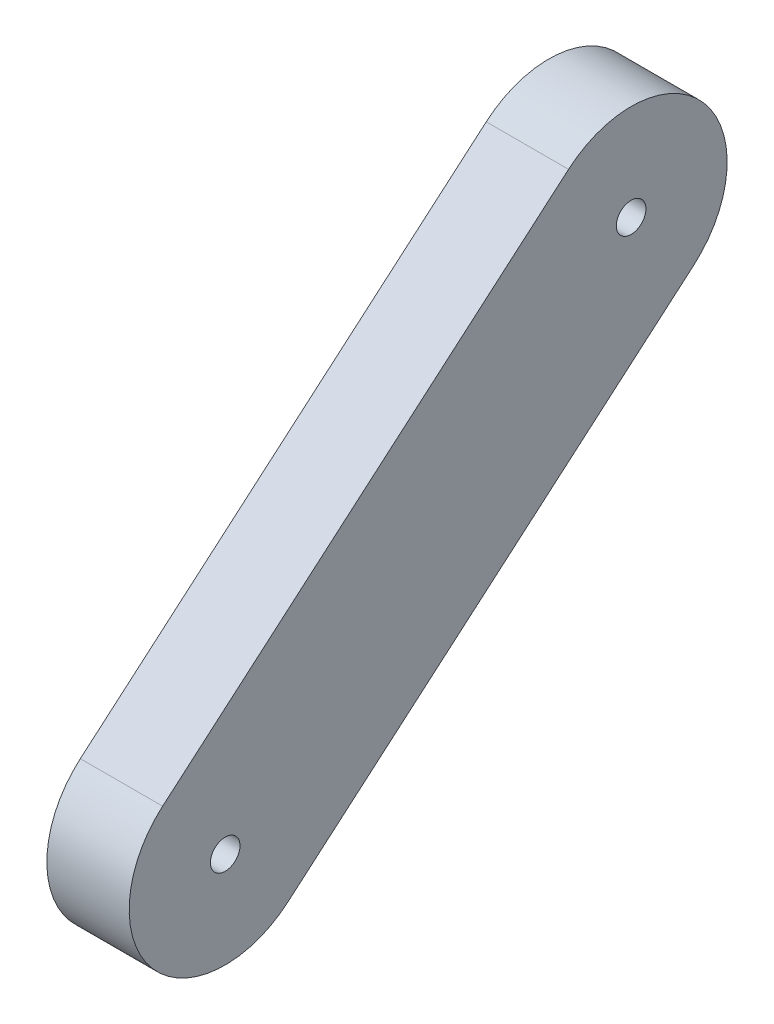
ISO-10303-21;
HEADER;
FILE_DESCRIPTION(('STEP AP214'),'2;1');
FILE_NAME('part.step','',(''),(''),'','','');
FILE_SCHEMA(('AUTOMOTIVE_DESIGN { 1 0 10303 214 1 1 1 1 }'));
ENDSEC;
DATA;
#1=APPLICATION_CONTEXT('core data for automotive mechanical design processes');
#2=APPLICATION_PROTOCOL_DEFINITION('international standard','automotive_design',2000,#1);
#3=PRODUCT_CONTEXT('',#1,'mechanical');
#4=PRODUCT('Part','Part','',(#3));
#5=PRODUCT_RELATED_PRODUCT_CATEGORY('part','',(#4));
#6=PRODUCT_DEFINITION_FORMATION('','',#4);
#7=PRODUCT_DEFINITION_CONTEXT('part definition',#1,'design');
#8=PRODUCT_DEFINITION('design','',#6,#7);
#9=PRODUCT_DEFINITION_SHAPE('','',#8);
#10=(LENGTH_UNIT() NAMED_UNIT(*) SI_UNIT(.MILLI.,.METRE.));
#11=(NAMED_UNIT(*) PLANE_ANGLE_UNIT() SI_UNIT($,.RADIAN.));
#12=(NAMED_UNIT(*) SI_UNIT($,.STERADIAN.) SOLID_ANGLE_UNIT());
#13=UNCERTAINTY_MEASURE_WITH_UNIT(LENGTH_MEASURE(1.E-05),#10,'distance_accuracy_value','');
#14=(GEOMETRIC_REPRESENTATION_CONTEXT(3) GLOBAL_UNCERTAINTY_ASSIGNED_CONTEXT((#13)) GLOBAL_UNIT_ASSIGNED_CONTEXT((#10,
#11,#12)) REPRESENTATION_CONTEXT('',''));
#15=CARTESIAN_POINT('',(0.,0.,0.));
#16=DIRECTION('',(0.,0.,1.));
#17=DIRECTION('',(1.,0.,0.));
#18=AXIS2_PLACEMENT_3D('',#15,#16,#17);
#19=CARTESIAN_POINT('',(12.827,-82.55,508.));
#20=DIRECTION('',(-1.,0.,0.));
#21=DIRECTION('',(0.,-1.,0.));
#22=AXIS2_PLACEMENT_3D('',#19,#20,#21);
#23=PLANE('',#22);
#24=CARTESIAN_POINT('',(12.827,-82.55,508.));
#25=DIRECTION('',(-1.,0.,0.));
#26=DIRECTION('',(0.,-1.,0.));
#27=AXIS2_PLACEMENT_3D('',#24,#25,#26);
#28=CIRCLE('',#27,6.84999999999996);
#29=CARTESIAN_POINT('',(12.827,-75.7,508.));
#30=VERTEX_POINT('',#29);
#31=EDGE_CURVE('E106',#30,#30,#28,.T.);
#32=ORIENTED_EDGE('',*,*,#31,.F.);
#33=EDGE_LOOP('',(#32));
#34=FACE_BOUND('',#33,.T.);
#35=CARTESIAN_POINT('',(12.827,-82.55,508.));
#36=DIRECTION('',(-1.,0.,0.));
#37=DIRECTION('',(0.,-1.,0.));
#38=AXIS2_PLACEMENT_3D('',#35,#36,#37);
#39=CIRCLE('',#38,44.45);
#40=CARTESIAN_POINT('',(12.827,-48.8282557456023,536.959393371426));
#41=VERTEX_POINT('',#40);
#42=CARTESIAN_POINT('',(12.827,-116.271744254398,479.040606628574));
#43=VERTEX_POINT('',#42);
#44=EDGE_CURVE('E91',#41,#43,#39,.T.);
#45=ORIENTED_EDGE('',*,*,#44,.T.);
#46=DIRECTION('',(0.,-0.651504912742992,0.758644415172053));
#47=VECTOR('',#46,1.);
#48=CARTESIAN_POINT('',(12.827,-116.271744254398,479.040606628574));
#49=LINE('',#48,#47);
#50=CARTESIAN_POINT('',(12.8270000000001,-277.6169358952,666.918896045933));
#51=VERTEX_POINT('',#50);
#52=EDGE_CURVE('E86',#43,#51,#49,.T.);
#53=ORIENTED_EDGE('',*,*,#52,.T.);
#54=CARTESIAN_POINT('',(12.8270000000001,-243.895191640802,695.878289417359));
#55=DIRECTION('',(-1.,0.,0.));
#56=DIRECTION('',(0.,-1.,0.));
#57=AXIS2_PLACEMENT_3D('',#54,#55,#56);
#58=CIRCLE('',#57,44.45);
#59=CARTESIAN_POINT('',(12.827,-210.173447386404,724.837682788785));
#60=VERTEX_POINT('',#59);
#61=EDGE_CURVE('E89',#51,#60,#58,.T.);
#62=ORIENTED_EDGE('',*,*,#61,.T.);
#63=DIRECTION('',(0.,0.651504912742992,-0.758644415172053));
#64=VECTOR('',#63,1.);
#65=CARTESIAN_POINT('',(12.827,-48.8282557456023,536.959393371426));
#66=LINE('',#65,#64);
#67=EDGE_CURVE('E56',#60,#41,#66,.T.);
#68=ORIENTED_EDGE('',*,*,#67,.T.);
#69=EDGE_LOOP('',(#45,#53,#62,#68));
#70=FACE_BOUND('',#69,.T.);
#71=CARTESIAN_POINT('',(12.8270000000001,-243.895191640802,695.878289417359));
#72=DIRECTION('',(-1.,0.,0.));
#73=DIRECTION('',(0.,-1.,0.));
#74=AXIS2_PLACEMENT_3D('',#71,#72,#73);
#75=CIRCLE('',#74,6.84999999999996);
#76=CARTESIAN_POINT('',(12.8270000000001,-237.045191640802,695.878289417359));
#77=VERTEX_POINT('',#76);
#78=EDGE_CURVE('E121',#77,#77,#75,.T.);
#79=ORIENTED_EDGE('',*,*,#78,.F.);
#80=EDGE_LOOP('',(#79));
#81=FACE_BOUND('',#80,.T.);
#82=ADVANCED_FACE('F39',(#34,#70,#81),#23,.T.);
#83=CARTESIAN_POINT('',(50.927,-82.55,508.));
#84=DIRECTION('',(-1.,0.,0.));
#85=DIRECTION('',(0.,-1.,0.));
#86=AXIS2_PLACEMENT_3D('',#83,#84,#85);
#87=PLANE('',#86);
#88=CARTESIAN_POINT('',(50.927,-82.55,508.));
#89=DIRECTION('',(-1.,0.,0.));
#90=DIRECTION('',(0.,-1.,0.));
#91=AXIS2_PLACEMENT_3D('',#88,#89,#90);
#92=CIRCLE('',#91,44.45);
#93=CARTESIAN_POINT('',(50.927,-48.8282557456023,536.959393371426));
#94=VERTEX_POINT('',#93);
#95=CARTESIAN_POINT('',(50.927,-116.271744254398,479.040606628574));
#96=VERTEX_POINT('',#95);
#97=EDGE_CURVE('E103',#94,#96,#92,.T.);
#98=ORIENTED_EDGE('',*,*,#97,.F.);
#99=DIRECTION('',(0.,0.651504912742992,-0.758644415172053));
#100=VECTOR('',#99,1.);
#101=CARTESIAN_POINT('',(50.927,-48.8282557456023,536.959393371426));
#102=LINE('',#101,#100);
#103=CARTESIAN_POINT('',(50.927,-210.173447386404,724.837682788785));
#104=VERTEX_POINT('',#103);
#105=EDGE_CURVE('E79',#104,#94,#102,.T.);
#106=ORIENTED_EDGE('',*,*,#105,.F.);
#107=CARTESIAN_POINT('',(50.9270000000001,-243.895191640802,695.878289417359));
#108=DIRECTION('',(-1.,0.,0.));
#109=DIRECTION('',(0.,-1.,0.));
#110=AXIS2_PLACEMENT_3D('',#107,#108,#109);
#111=CIRCLE('',#110,44.45);
#112=CARTESIAN_POINT('',(50.9270000000001,-277.6169358952,666.918896045933));
#113=VERTEX_POINT('',#112);
#114=EDGE_CURVE('E73',#113,#104,#111,.T.);
#115=ORIENTED_EDGE('',*,*,#114,.F.);
#116=DIRECTION('',(0.,-0.651504912742992,0.758644415172053));
#117=VECTOR('',#116,1.);
#118=CARTESIAN_POINT('',(50.927,-116.271744254398,479.040606628574));
#119=LINE('',#118,#117);
#120=EDGE_CURVE('E95',#96,#113,#119,.T.);
#121=ORIENTED_EDGE('',*,*,#120,.F.);
#122=EDGE_LOOP('',(#98,#106,#115,#121));
#123=FACE_BOUND('',#122,.T.);
#124=CARTESIAN_POINT('',(50.927,-82.55,508.));
#125=DIRECTION('',(-1.,0.,0.));
#126=DIRECTION('',(0.,-1.,0.));
#127=AXIS2_PLACEMENT_3D('',#124,#125,#126);
#128=CIRCLE('',#127,6.84999999999996);
#129=CARTESIAN_POINT('',(50.927,-75.7,508.));
#130=VERTEX_POINT('',#129);
#131=EDGE_CURVE('E118',#130,#130,#128,.T.);
#132=ORIENTED_EDGE('',*,*,#131,.T.);
#133=EDGE_LOOP('',(#132));
#134=FACE_BOUND('',#133,.T.);
#135=CARTESIAN_POINT('',(50.9270000000001,-243.895191640802,695.878289417359));
#136=DIRECTION('',(-1.,0.,0.));
#137=DIRECTION('',(0.,-1.,0.));
#138=AXIS2_PLACEMENT_3D('',#135,#136,#137);
#139=CIRCLE('',#138,6.84999999999996);
#140=CARTESIAN_POINT('',(50.9270000000001,-237.045191640802,695.878289417359));
#141=VERTEX_POINT('',#140);
#142=EDGE_CURVE('E124',#141,#141,#139,.T.);
#143=ORIENTED_EDGE('',*,*,#142,.T.);
#144=EDGE_LOOP('',(#143));
#145=FACE_BOUND('',#144,.T.);
#146=ADVANCED_FACE('F114',(#123,#134,#145),#87,.F.);
#147=CARTESIAN_POINT('',(12.827,-82.55,508.));
#148=DIRECTION('',(1.,0.,0.));
#149=DIRECTION('',(0.,1.,0.));
#150=AXIS2_PLACEMENT_3D('',#147,#148,#149);
#151=CYLINDRICAL_SURFACE('',#150,44.45);
#152=ORIENTED_EDGE('',*,*,#97,.T.);
#153=DIRECTION('',(1.,0.,0.));
#154=VECTOR('',#153,1.);
#155=CARTESIAN_POINT('',(12.827,-116.271744254398,479.040606628574));
#156=LINE('',#155,#154);
#157=EDGE_CURVE('E11',#43,#96,#156,.T.);
#158=ORIENTED_EDGE('',*,*,#157,.F.);
#159=ORIENTED_EDGE('',*,*,#44,.F.);
#160=DIRECTION('',(1.,0.,0.));
#161=VECTOR('',#160,1.);
#162=CARTESIAN_POINT('',(12.827,-48.8282557456023,536.959393371426));
#163=LINE('',#162,#161);
#164=EDGE_CURVE('E99',#41,#94,#163,.T.);
#165=ORIENTED_EDGE('',*,*,#164,.T.);
#166=EDGE_LOOP('',(#152,#158,#159,#165));
#167=FACE_BOUND('',#166,.T.);
#168=ADVANCED_FACE('F41',(#167),#151,.T.);
#169=CARTESIAN_POINT('',(12.827,-116.271744254398,479.040606628574));
#170=DIRECTION('',(0.,0.758644415172053,0.651504912742992));
#171=DIRECTION('',(0.,-0.651504912742992,0.758644415172053));
#172=AXIS2_PLACEMENT_3D('',#169,#170,#171);
#173=PLANE('',#172);
#174=ORIENTED_EDGE('',*,*,#120,.T.);
#175=DIRECTION('',(1.,0.,0.));
#176=VECTOR('',#175,1.);
#177=CARTESIAN_POINT('',(12.8270000000001,-277.6169358952,666.918896045933));
#178=LINE('',#177,#176);
#179=EDGE_CURVE('E48',#51,#113,#178,.T.);
#180=ORIENTED_EDGE('',*,*,#179,.F.);
#181=ORIENTED_EDGE('',*,*,#52,.F.);
#182=ORIENTED_EDGE('',*,*,#157,.T.);
#183=EDGE_LOOP('',(#174,#180,#181,#182));
#184=FACE_BOUND('',#183,.T.);
#185=ADVANCED_FACE('F94',(#184),#173,.F.);
#186=CARTESIAN_POINT('',(12.8270000000001,-243.895191640802,695.878289417359));
#187=DIRECTION('',(1.,0.,0.));
#188=DIRECTION('',(0.,1.,0.));
#189=AXIS2_PLACEMENT_3D('',#186,#187,#188);
#190=CYLINDRICAL_SURFACE('',#189,44.45);
#191=ORIENTED_EDGE('',*,*,#114,.T.);
#192=DIRECTION('',(1.,0.,0.));
#193=VECTOR('',#192,1.);
#194=CARTESIAN_POINT('',(12.827,-210.173447386404,724.837682788785));
#195=LINE('',#194,#193);
#196=EDGE_CURVE('E96',#60,#104,#195,.T.);
#197=ORIENTED_EDGE('',*,*,#196,.F.);
#198=ORIENTED_EDGE('',*,*,#61,.F.);
#199=ORIENTED_EDGE('',*,*,#179,.T.);
#200=EDGE_LOOP('',(#191,#197,#198,#199));
#201=FACE_BOUND('',#200,.T.);
#202=ADVANCED_FACE('F97',(#201),#190,.T.);
#203=CARTESIAN_POINT('',(12.827,-48.8282557456023,536.959393371426));
#204=DIRECTION('',(0.,-0.758644415172053,-0.651504912742992));
#205=DIRECTION('',(0.,0.651504912742992,-0.758644415172053));
#206=AXIS2_PLACEMENT_3D('',#203,#204,#205);
#207=PLANE('',#206);
#208=ORIENTED_EDGE('',*,*,#105,.T.);
#209=ORIENTED_EDGE('',*,*,#164,.F.);
#210=ORIENTED_EDGE('',*,*,#67,.F.);
#211=ORIENTED_EDGE('',*,*,#196,.T.);
#212=EDGE_LOOP('',(#208,#209,#210,#211));
#213=FACE_BOUND('',#212,.T.);
#214=ADVANCED_FACE('F111',(#213),#207,.F.);
#215=CARTESIAN_POINT('',(12.827,-82.55,508.));
#216=DIRECTION('',(1.,0.,0.));
#217=DIRECTION('',(0.,1.,0.));
#218=AXIS2_PLACEMENT_3D('',#215,#216,#217);
#219=CYLINDRICAL_SURFACE('',#218,6.84999999999996);
#220=CARTESIAN_POINT('',(12.827,-75.7,508.));
#221=CARTESIAN_POINT('',(13.223875,-75.7,508.));
#222=CARTESIAN_POINT('',(13.62075,-75.7,508.));
#223=CARTESIAN_POINT('',(14.4145,-75.7,508.));
#224=CARTESIAN_POINT('',(14.811375,-75.7,508.));
#225=CARTESIAN_POINT('',(15.605125,-75.7,508.));
#226=CARTESIAN_POINT('',(16.002,-75.7,508.));
#227=CARTESIAN_POINT('',(16.79575,-75.7,508.));
#228=CARTESIAN_POINT('',(17.192625,-75.7,508.));
#229=CARTESIAN_POINT('',(17.986375,-75.7,508.));
#230=CARTESIAN_POINT('',(18.38325,-75.7,508.));
#231=CARTESIAN_POINT('',(19.177,-75.7,508.));
#232=CARTESIAN_POINT('',(19.573875,-75.7,508.));
#233=CARTESIAN_POINT('',(20.367625,-75.7,508.));
#234=CARTESIAN_POINT('',(20.7645,-75.7,508.));
#235=CARTESIAN_POINT('',(21.55825,-75.7,508.));
#236=CARTESIAN_POINT('',(21.955125,-75.7,508.));
#237=CARTESIAN_POINT('',(22.748875,-75.7,508.));
#238=CARTESIAN_POINT('',(23.14575,-75.7,508.));
#239=CARTESIAN_POINT('',(23.9395,-75.7,508.));
#240=CARTESIAN_POINT('',(24.336375,-75.7,508.));
#241=CARTESIAN_POINT('',(25.130125,-75.7,508.));
#242=CARTESIAN_POINT('',(25.527,-75.7,508.));
#243=CARTESIAN_POINT('',(26.32075,-75.7,508.));
#244=CARTESIAN_POINT('',(26.717625,-75.7,508.));
#245=CARTESIAN_POINT('',(27.511375,-75.7,508.));
#246=CARTESIAN_POINT('',(27.90825,-75.7,508.));
#247=CARTESIAN_POINT('',(28.702,-75.7,508.));
#248=CARTESIAN_POINT('',(29.098875,-75.7,508.));
#249=CARTESIAN_POINT('',(29.892625,-75.7,508.));
#250=CARTESIAN_POINT('',(30.2895,-75.7,508.));
#251=CARTESIAN_POINT('',(31.08325,-75.7,508.));
#252=CARTESIAN_POINT('',(31.480125,-75.7,508.));
#253=CARTESIAN_POINT('',(32.273875,-75.7,508.));
#254=CARTESIAN_POINT('',(32.67075,-75.7,508.));
#255=CARTESIAN_POINT('',(33.4645,-75.7,508.));
#256=CARTESIAN_POINT('',(33.861375,-75.7,508.));
#257=CARTESIAN_POINT('',(34.655125,-75.7,508.));
#258=CARTESIAN_POINT('',(35.052,-75.7,508.));
#259=CARTESIAN_POINT('',(35.84575,-75.7,508.));
#260=CARTESIAN_POINT('',(36.242625,-75.7,508.));
#261=CARTESIAN_POINT('',(37.036375,-75.7,508.));
#262=CARTESIAN_POINT('',(37.43325,-75.7,508.));
#263=CARTESIAN_POINT('',(38.227,-75.7,508.));
#264=CARTESIAN_POINT('',(38.623875,-75.7,508.));
#265=CARTESIAN_POINT('',(39.417625,-75.7,508.));
#266=CARTESIAN_POINT('',(39.8145,-75.7,508.));
#267=CARTESIAN_POINT('',(40.60825,-75.7,508.));
#268=CARTESIAN_POINT('',(41.005125,-75.7,508.));
#269=CARTESIAN_POINT('',(41.798875,-75.7,508.));
#270=CARTESIAN_POINT('',(42.19575,-75.7,508.));
#271=CARTESIAN_POINT('',(42.9895,-75.7,508.));
#272=CARTESIAN_POINT('',(43.386375,-75.7,508.));
#273=CARTESIAN_POINT('',(44.180125,-75.7,508.));
#274=CARTESIAN_POINT('',(44.577,-75.7,508.));
#275=CARTESIAN_POINT('',(45.37075,-75.7,508.));
#276=CARTESIAN_POINT('',(45.767625,-75.7,508.));
#277=CARTESIAN_POINT('',(46.561375,-75.7,508.));
#278=CARTESIAN_POINT('',(46.95825,-75.7,508.));
#279=CARTESIAN_POINT('',(47.752,-75.7,508.));
#280=CARTESIAN_POINT('',(48.148875,-75.7,508.));
#281=CARTESIAN_POINT('',(48.942625,-75.7,508.));
#282=CARTESIAN_POINT('',(49.3395,-75.7,508.));
#283=CARTESIAN_POINT('',(50.13325,-75.7,508.));
#284=CARTESIAN_POINT('',(50.530125,-75.7,508.));
#285=CARTESIAN_POINT('',(50.927,-75.7,508.));
#286=B_SPLINE_CURVE_WITH_KNOTS('',3,(#220,#221,#222,#223,#224,#225,#226,#227,#228,#229,#230,
#231,#232,#233,#234,#235,#236,#237,#238,#239,#240,#241,#242,#243,#244,#245,#246,#247,#248,#249,
#250,#251,#252,#253,#254,#255,#256,#257,#258,#259,#260,#261,#262,#263,#264,#265,#266,#267,#268,
#269,#270,#271,#272,#273,#274,#275,#276,#277,#278,#279,#280,#281,#282,#283,#284,#285),
.UNSPECIFIED.,.F.,.F.,(4,2,2,2,2,2,2,2,2,2,2,2,2,2,2,2,2,2,2,2,2,2,2,2,2,2,2,2,2,2,2,2,4),(0.,
1.190625,2.38125,3.571875,4.7625,5.953125,7.14375,8.334375,9.525,10.715625,11.90625,13.096875,
14.2875,15.478125,16.66875,17.859375,19.05,20.240625,21.43125,22.621875,23.8125,25.003125,
26.19375,27.384375,28.575,29.765625,30.95625,32.146875,33.3375,34.528125,35.71875,36.909375,
38.1),.UNSPECIFIED.);
#287=EDGE_CURVE('BSEAM141',#30,#130,#286,.T.);
#288=ORIENTED_EDGE('',*,*,#31,.T.);
#289=ORIENTED_EDGE('',*,*,#131,.F.);
#290=ORIENTED_EDGE('',*,*,#287,.T.);
#291=ORIENTED_EDGE('',*,*,#287,.F.);
#292=EDGE_LOOP('',(#288,#290,#289,#291));
#293=FACE_BOUND('',#292,.T.);
#294=ADVANCED_FACE('F141',(#293),#219,.F.);
#295=CARTESIAN_POINT('',(12.8270000000001,-243.895191640802,695.878289417359));
#296=DIRECTION('',(1.,0.,0.));
#297=DIRECTION('',(0.,1.,0.));
#298=AXIS2_PLACEMENT_3D('',#295,#296,#297);
#299=CYLINDRICAL_SURFACE('',#298,6.84999999999996);
#300=CARTESIAN_POINT('',(12.8270000000001,-237.045191640802,695.878289417359));
#301=CARTESIAN_POINT('',(13.2238750000001,-237.045191640802,695.878289417359));
#302=CARTESIAN_POINT('',(13.6207500000001,-237.045191640802,695.878289417359));
#303=CARTESIAN_POINT('',(14.4145000000001,-237.045191640802,695.878289417359));
#304=CARTESIAN_POINT('',(14.8113750000001,-237.045191640802,695.878289417359));
#305=CARTESIAN_POINT('',(15.6051250000001,-237.045191640802,695.878289417359));
#306=CARTESIAN_POINT('',(16.0020000000001,-237.045191640802,695.878289417359));
#307=CARTESIAN_POINT('',(16.7957500000001,-237.045191640802,695.878289417359));
#308=CARTESIAN_POINT('',(17.1926250000001,-237.045191640802,695.878289417359));
#309=CARTESIAN_POINT('',(17.9863750000001,-237.045191640802,695.878289417359));
#310=CARTESIAN_POINT('',(18.3832500000001,-237.045191640802,695.878289417359));
#311=CARTESIAN_POINT('',(19.1770000000001,-237.045191640802,695.878289417359));
#312=CARTESIAN_POINT('',(19.5738750000001,-237.045191640802,695.878289417359));
#313=CARTESIAN_POINT('',(20.3676250000001,-237.045191640802,695.878289417359));
#314=CARTESIAN_POINT('',(20.7645000000001,-237.045191640802,695.878289417359));
#315=CARTESIAN_POINT('',(21.5582500000001,-237.045191640802,695.878289417359));
#316=CARTESIAN_POINT('',(21.9551250000001,-237.045191640802,695.878289417359));
#317=CARTESIAN_POINT('',(22.7488750000001,-237.045191640802,695.878289417359));
#318=CARTESIAN_POINT('',(23.1457500000001,-237.045191640802,695.878289417359));
#319=CARTESIAN_POINT('',(23.9395000000001,-237.045191640802,695.878289417359));
#320=CARTESIAN_POINT('',(24.3363750000001,-237.045191640802,695.878289417359));
#321=CARTESIAN_POINT('',(25.1301250000001,-237.045191640802,695.878289417359));
#322=CARTESIAN_POINT('',(25.5270000000001,-237.045191640802,695.878289417359));
#323=CARTESIAN_POINT('',(26.3207500000001,-237.045191640802,695.878289417359));
#324=CARTESIAN_POINT('',(26.7176250000001,-237.045191640802,695.878289417359));
#325=CARTESIAN_POINT('',(27.5113750000001,-237.045191640802,695.878289417359));
#326=CARTESIAN_POINT('',(27.9082500000001,-237.045191640802,695.878289417359));
#327=CARTESIAN_POINT('',(28.7020000000001,-237.045191640802,695.878289417359));
#328=CARTESIAN_POINT('',(29.0988750000001,-237.045191640802,695.878289417359));
#329=CARTESIAN_POINT('',(29.8926250000001,-237.045191640802,695.878289417359));
#330=CARTESIAN_POINT('',(30.2895000000001,-237.045191640802,695.878289417359));
#331=CARTESIAN_POINT('',(31.0832500000001,-237.045191640802,695.878289417359));
#332=CARTESIAN_POINT('',(31.4801250000001,-237.045191640802,695.878289417359));
#333=CARTESIAN_POINT('',(32.273875,-237.045191640802,695.878289417359));
#334=CARTESIAN_POINT('',(32.6707500000001,-237.045191640802,695.878289417359));
#335=CARTESIAN_POINT('',(33.4645000000001,-237.045191640802,695.878289417359));
#336=CARTESIAN_POINT('',(33.8613750000001,-237.045191640802,695.878289417359));
#337=CARTESIAN_POINT('',(34.655125,-237.045191640802,695.878289417359));
#338=CARTESIAN_POINT('',(35.0520000000001,-237.045191640802,695.878289417359));
#339=CARTESIAN_POINT('',(35.8457500000001,-237.045191640802,695.878289417359));
#340=CARTESIAN_POINT('',(36.2426250000001,-237.045191640802,695.878289417359));
#341=CARTESIAN_POINT('',(37.036375,-237.045191640802,695.878289417359));
#342=CARTESIAN_POINT('',(37.4332500000001,-237.045191640802,695.878289417359));
#343=CARTESIAN_POINT('',(38.2270000000001,-237.045191640802,695.878289417359));
#344=CARTESIAN_POINT('',(38.6238750000001,-237.045191640802,695.878289417359));
#345=CARTESIAN_POINT('',(39.4176250000001,-237.045191640802,695.878289417359));
#346=CARTESIAN_POINT('',(39.8145000000001,-237.045191640802,695.878289417359));
#347=CARTESIAN_POINT('',(40.6082500000001,-237.045191640802,695.878289417359));
#348=CARTESIAN_POINT('',(41.0051250000001,-237.045191640802,695.878289417359));
#349=CARTESIAN_POINT('',(41.7988750000001,-237.045191640802,695.878289417359));
#350=CARTESIAN_POINT('',(42.1957500000001,-237.045191640802,695.878289417359));
#351=CARTESIAN_POINT('',(42.9895000000001,-237.045191640802,695.878289417359));
#352=CARTESIAN_POINT('',(43.3863750000001,-237.045191640802,695.878289417359));
#353=CARTESIAN_POINT('',(44.1801250000001,-237.045191640802,695.878289417359));
#354=CARTESIAN_POINT('',(44.5770000000001,-237.045191640802,695.878289417359));
#355=CARTESIAN_POINT('',(45.3707500000001,-237.045191640802,695.878289417359));
#356=CARTESIAN_POINT('',(45.7676250000001,-237.045191640802,695.878289417359));
#357=CARTESIAN_POINT('',(46.561375,-237.045191640802,695.878289417359));
#358=CARTESIAN_POINT('',(46.9582500000001,-237.045191640802,695.878289417359));
#359=CARTESIAN_POINT('',(47.7520000000001,-237.045191640802,695.878289417359));
#360=CARTESIAN_POINT('',(48.1488750000001,-237.045191640802,695.878289417359));
#361=CARTESIAN_POINT('',(48.942625,-237.045191640802,695.878289417359));
#362=CARTESIAN_POINT('',(49.3395000000001,-237.045191640802,695.878289417359));
#363=CARTESIAN_POINT('',(50.1332500000001,-237.045191640802,695.878289417359));
#364=CARTESIAN_POINT('',(50.5301250000001,-237.045191640802,695.878289417359));
#365=CARTESIAN_POINT('',(50.9270000000001,-237.045191640802,695.878289417359));
#366=B_SPLINE_CURVE_WITH_KNOTS('',3,(#300,#301,#302,#303,#304,#305,#306,#307,#308,#309,#310,
#311,#312,#313,#314,#315,#316,#317,#318,#319,#320,#321,#322,#323,#324,#325,#326,#327,#328,#329,
#330,#331,#332,#333,#334,#335,#336,#337,#338,#339,#340,#341,#342,#343,#344,#345,#346,#347,#348,
#349,#350,#351,#352,#353,#354,#355,#356,#357,#358,#359,#360,#361,#362,#363,#364,#365),
.UNSPECIFIED.,.F.,.F.,(4,2,2,2,2,2,2,2,2,2,2,2,2,2,2,2,2,2,2,2,2,2,2,2,2,2,2,2,2,2,2,2,4),(0.,
1.190625,2.38125,3.571875,4.7625,5.953125,7.14375,8.334375,9.525,10.715625,11.90625,13.096875,
14.2875,15.478125,16.66875,17.859375,19.05,20.240625,21.43125,22.621875,23.8125,25.003125,
26.19375,27.384375,28.575,29.765625,30.95625,32.146875,33.3375,34.528125,35.71875,36.909375,
38.1),.UNSPECIFIED.);
#367=EDGE_CURVE('BSEAM130',#77,#141,#366,.T.);
#368=ORIENTED_EDGE('',*,*,#78,.T.);
#369=ORIENTED_EDGE('',*,*,#142,.F.);
#370=ORIENTED_EDGE('',*,*,#367,.T.);
#371=ORIENTED_EDGE('',*,*,#367,.F.);
#372=EDGE_LOOP('',(#368,#370,#369,#371));
#373=FACE_BOUND('',#372,.T.);
#374=ADVANCED_FACE('F130',(#373),#299,.F.);
#375=CLOSED_SHELL('',(#82,#146,#168,#185,#202,#214,#294,#374));
#376=MANIFOLD_SOLID_BREP('B2',#375);
#377=ADVANCED_BREP_SHAPE_REPRESENTATION('',(#18,#376),#14);
#378=SHAPE_DEFINITION_REPRESENTATION(#9,#377);
ENDSEC;
END-ISO-10303-21;
